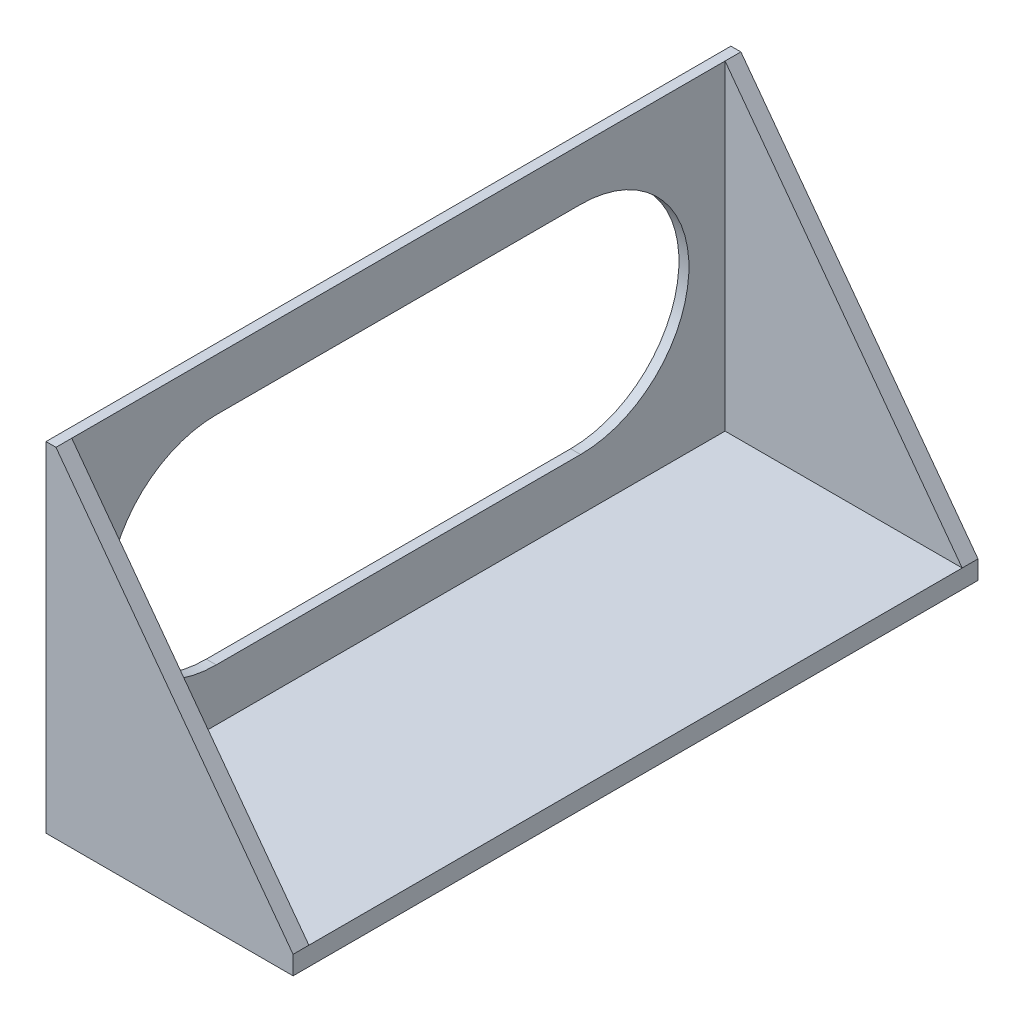
ISO-10303-21;
HEADER;
FILE_DESCRIPTION(('STEP AP214'),'2;1');
FILE_NAME('part.step','',(''),(''),'','','');
FILE_SCHEMA(('AUTOMOTIVE_DESIGN { 1 0 10303 214 1 1 1 1 }'));
ENDSEC;
DATA;
#1=APPLICATION_CONTEXT('core data for automotive mechanical design processes');
#2=APPLICATION_PROTOCOL_DEFINITION('international standard','automotive_design',2000,#1);
#3=PRODUCT_CONTEXT('',#1,'mechanical');
#4=PRODUCT('Part','Part','',(#3));
#5=PRODUCT_RELATED_PRODUCT_CATEGORY('part','',(#4));
#6=PRODUCT_DEFINITION_FORMATION('','',#4);
#7=PRODUCT_DEFINITION_CONTEXT('part definition',#1,'design');
#8=PRODUCT_DEFINITION('design','',#6,#7);
#9=PRODUCT_DEFINITION_SHAPE('','',#8);
#10=(LENGTH_UNIT() NAMED_UNIT(*) SI_UNIT(.MILLI.,.METRE.));
#11=(NAMED_UNIT(*) PLANE_ANGLE_UNIT() SI_UNIT($,.RADIAN.));
#12=(NAMED_UNIT(*) SI_UNIT($,.STERADIAN.) SOLID_ANGLE_UNIT());
#13=UNCERTAINTY_MEASURE_WITH_UNIT(LENGTH_MEASURE(1.E-05),#10,'distance_accuracy_value','');
#14=(GEOMETRIC_REPRESENTATION_CONTEXT(3) GLOBAL_UNCERTAINTY_ASSIGNED_CONTEXT((#13)) GLOBAL_UNIT_ASSIGNED_CONTEXT((#10,
#11,#12)) REPRESENTATION_CONTEXT('',''));
#15=CARTESIAN_POINT('',(0.,0.,0.));
#16=DIRECTION('',(0.,0.,1.));
#17=DIRECTION('',(1.,0.,0.));
#18=AXIS2_PLACEMENT_3D('',#15,#16,#17);
#19=CARTESIAN_POINT('',(-154.102,67.31,155.702));
#20=DIRECTION('',(-1.,0.,0.));
#21=DIRECTION('',(0.,0.,1.));
#22=AXIS2_PLACEMENT_3D('',#19,#20,#21);
#23=PLANE('',#22);
#24=CARTESIAN_POINT('',(-154.102,25.75,29.275));
#25=DIRECTION('',(-1.,0.,0.));
#26=DIRECTION('',(0.,0.,1.));
#27=AXIS2_PLACEMENT_3D('',#24,#25,#26);
#28=CIRCLE('',#27,17.4);
#29=CARTESIAN_POINT('',(-154.102,21.,46.014100931651));
#30=VERTEX_POINT('',#29);
#31=CARTESIAN_POINT('',(-154.102,8.35,29.275));
#32=VERTEX_POINT('',#31);
#33=EDGE_CURVE('E43',#30,#32,#28,.F.);
#34=ORIENTED_EDGE('',*,*,#33,.F.);
#35=DIRECTION('',(0.,0.,-1.));
#36=VECTOR('',#35,1.);
#37=CARTESIAN_POINT('',(-154.102,21.,46.014100931651));
#38=LINE('',#37,#36);
#39=CARTESIAN_POINT('',(-154.102,21.,48.175));
#40=VERTEX_POINT('',#39);
#41=EDGE_CURVE('E38',#40,#30,#38,.T.);
#42=ORIENTED_EDGE('',*,*,#41,.F.);
#43=DIRECTION('',(0.,-1.,0.));
#44=VECTOR('',#43,1.);
#45=CARTESIAN_POINT('',(-154.102,30.5,48.175));
#46=LINE('',#45,#44);
#47=CARTESIAN_POINT('',(-154.102,30.5,48.175));
#48=VERTEX_POINT('',#47);
#49=EDGE_CURVE('E111',#48,#40,#46,.T.);
#50=ORIENTED_EDGE('',*,*,#49,.F.);
#51=DIRECTION('',(0.,0.,1.));
#52=VECTOR('',#51,1.);
#53=CARTESIAN_POINT('',(-154.102,30.5,46.014100931651));
#54=LINE('',#53,#52);
#55=CARTESIAN_POINT('',(-154.102,30.5,46.014100931651));
#56=VERTEX_POINT('',#55);
#57=EDGE_CURVE('E118',#56,#48,#54,.T.);
#58=ORIENTED_EDGE('',*,*,#57,.F.);
#59=CARTESIAN_POINT('',(-154.102,43.15,29.275));
#60=VERTEX_POINT('',#59);
#61=EDGE_CURVE('E144',#60,#56,#28,.F.);
#62=ORIENTED_EDGE('',*,*,#61,.F.);
#63=DIRECTION('',(0.,0.,1.));
#64=VECTOR('',#63,1.);
#65=CARTESIAN_POINT('',(-154.102,43.15,-29.275));
#66=LINE('',#65,#64);
#67=CARTESIAN_POINT('',(-154.102,43.15,-29.275));
#68=VERTEX_POINT('',#67);
#69=EDGE_CURVE('E147',#68,#60,#66,.T.);
#70=ORIENTED_EDGE('',*,*,#69,.F.);
#71=CARTESIAN_POINT('',(-154.102,25.75,-29.275));
#72=DIRECTION('',(-1.,0.,0.));
#73=DIRECTION('',(0.,0.,1.));
#74=AXIS2_PLACEMENT_3D('',#71,#72,#73);
#75=CIRCLE('',#74,17.4);
#76=CARTESIAN_POINT('',(-154.102,8.35,-29.275));
#77=VERTEX_POINT('',#76);
#78=EDGE_CURVE('E60',#77,#68,#75,.F.);
#79=ORIENTED_EDGE('',*,*,#78,.F.);
#80=DIRECTION('',(0.,0.,-1.));
#81=VECTOR('',#80,1.);
#82=CARTESIAN_POINT('',(-154.102,8.35,-29.275));
#83=LINE('',#82,#81);
#84=EDGE_CURVE('E168',#32,#77,#83,.T.);
#85=ORIENTED_EDGE('',*,*,#84,.F.);
#86=EDGE_LOOP('',(#34,#42,#50,#58,#62,#70,#79,#85));
#87=FACE_BOUND('',#86,.T.);
#88=DIRECTION('',(0.,-1.,0.));
#89=VECTOR('',#88,1.);
#90=CARTESIAN_POINT('',(-154.102,67.31,-52.485));
#91=LINE('',#90,#89);
#92=CARTESIAN_POINT('',(-154.102,51.5,-52.485));
#93=VERTEX_POINT('',#92);
#94=CARTESIAN_POINT('',(-154.102,0.,-52.485));
#95=VERTEX_POINT('',#94);
#96=EDGE_CURVE('E227',#93,#95,#91,.T.);
#97=ORIENTED_EDGE('',*,*,#96,.F.);
#98=DIRECTION('',(0.,0.,1.));
#99=VECTOR('',#98,1.);
#100=CARTESIAN_POINT('',(-154.102,51.5,-55.025));
#101=LINE('',#100,#99);
#102=CARTESIAN_POINT('',(-154.102,51.5,52.485));
#103=VERTEX_POINT('',#102);
#104=EDGE_CURVE('E179',#93,#103,#101,.T.);
#105=ORIENTED_EDGE('',*,*,#104,.T.);
#106=DIRECTION('',(0.,1.,0.));
#107=VECTOR('',#106,1.);
#108=CARTESIAN_POINT('',(-154.102,67.31,52.485));
#109=LINE('',#108,#107);
#110=CARTESIAN_POINT('',(-154.102,0.,52.485));
#111=VERTEX_POINT('',#110);
#112=EDGE_CURVE('E217',#111,#103,#109,.T.);
#113=ORIENTED_EDGE('',*,*,#112,.F.);
#114=DIRECTION('',(0.,0.,-1.));
#115=VECTOR('',#114,1.);
#116=CARTESIAN_POINT('',(-154.102,0.,55.025));
#117=LINE('',#116,#115);
#118=EDGE_CURVE('E170',#111,#95,#117,.T.);
#119=ORIENTED_EDGE('',*,*,#118,.T.);
#120=EDGE_LOOP('',(#97,#105,#113,#119));
#121=FACE_BOUND('',#120,.T.);
#122=ADVANCED_FACE('F34',(#87,#121),#23,.F.);
#123=CARTESIAN_POINT('',(-265.792882910439,0.,55.025));
#124=DIRECTION('',(0.,1.,0.));
#125=DIRECTION('',(0.,0.,1.));
#126=AXIS2_PLACEMENT_3D('',#123,#124,#125);
#127=PLANE('',#126);
#128=DIRECTION('',(0.,0.,1.));
#129=VECTOR('',#128,1.);
#130=CARTESIAN_POINT('',(-116.002,0.,55.025));
#131=LINE('',#130,#129);
#132=CARTESIAN_POINT('',(-116.002,0.,-52.485));
#133=VERTEX_POINT('',#132);
#134=CARTESIAN_POINT('',(-116.002,0.,52.485));
#135=VERTEX_POINT('',#134);
#136=EDGE_CURVE('E203',#133,#135,#131,.T.);
#137=ORIENTED_EDGE('',*,*,#136,.F.);
#138=DIRECTION('',(-1.,0.,0.));
#139=VECTOR('',#138,1.);
#140=CARTESIAN_POINT('',(-265.792882910439,0.,-52.485));
#141=LINE('',#140,#139);
#142=EDGE_CURVE('E232',#133,#95,#141,.T.);
#143=ORIENTED_EDGE('',*,*,#142,.T.);
#144=ORIENTED_EDGE('',*,*,#118,.F.);
#145=DIRECTION('',(1.,0.,0.));
#146=VECTOR('',#145,1.);
#147=CARTESIAN_POINT('',(-265.792882910439,0.,52.485));
#148=LINE('',#147,#146);
#149=EDGE_CURVE('E220',#111,#135,#148,.T.);
#150=ORIENTED_EDGE('',*,*,#149,.T.);
#151=EDGE_LOOP('',(#137,#143,#144,#150));
#152=FACE_BOUND('',#151,.T.);
#153=ADVANCED_FACE('F296',(#152),#127,.T.);
#154=CARTESIAN_POINT('',(155.703,8.35,-29.275));
#155=DIRECTION('',(0.,-1.,0.));
#156=DIRECTION('',(0.,0.,-1.));
#157=AXIS2_PLACEMENT_3D('',#154,#155,#156);
#158=PLANE('',#157);
#159=DIRECTION('',(-1.,0.,0.));
#160=VECTOR('',#159,1.);
#161=CARTESIAN_POINT('',(155.703,8.35,29.275));
#162=LINE('',#161,#160);
#163=CARTESIAN_POINT('',(-155.702,8.35,29.275));
#164=VERTEX_POINT('',#163);
#165=EDGE_CURVE('E12',#32,#164,#162,.T.);
#166=ORIENTED_EDGE('',*,*,#165,.F.);
#167=ORIENTED_EDGE('',*,*,#84,.T.);
#168=DIRECTION('',(-1.,0.,0.));
#169=VECTOR('',#168,1.);
#170=CARTESIAN_POINT('',(155.703,8.35,-29.275));
#171=LINE('',#170,#169);
#172=CARTESIAN_POINT('',(-155.702,8.35,-29.275));
#173=VERTEX_POINT('',#172);
#174=EDGE_CURVE('E161',#77,#173,#171,.T.);
#175=ORIENTED_EDGE('',*,*,#174,.T.);
#176=DIRECTION('',(0.,0.,1.));
#177=VECTOR('',#176,1.);
#178=CARTESIAN_POINT('',(-155.702,8.35,-29.275));
#179=LINE('',#178,#177);
#180=EDGE_CURVE('E154',#173,#164,#179,.T.);
#181=ORIENTED_EDGE('',*,*,#180,.T.);
#182=EDGE_LOOP('',(#166,#167,#175,#181));
#183=FACE_BOUND('',#182,.T.);
#184=ADVANCED_FACE('F328',(#183),#158,.F.);
#185=CARTESIAN_POINT('',(155.703,25.75,-29.275));
#186=DIRECTION('',(-1.,0.,0.));
#187=DIRECTION('',(0.,0.,1.));
#188=AXIS2_PLACEMENT_3D('',#185,#186,#187);
#189=CYLINDRICAL_SURFACE('',#188,17.4);
#190=ORIENTED_EDGE('',*,*,#174,.F.);
#191=ORIENTED_EDGE('',*,*,#78,.T.);
#192=DIRECTION('',(-1.,0.,0.));
#193=VECTOR('',#192,1.);
#194=CARTESIAN_POINT('',(155.703,43.15,-29.275));
#195=LINE('',#194,#193);
#196=CARTESIAN_POINT('',(-155.702,43.15,-29.275));
#197=VERTEX_POINT('',#196);
#198=EDGE_CURVE('E153',#68,#197,#195,.T.);
#199=ORIENTED_EDGE('',*,*,#198,.T.);
#200=CARTESIAN_POINT('',(-155.702,25.75,-29.275));
#201=DIRECTION('',(-1.,0.,0.));
#202=DIRECTION('',(0.,0.,1.));
#203=AXIS2_PLACEMENT_3D('',#200,#201,#202);
#204=CIRCLE('',#203,17.4);
#205=EDGE_CURVE('E151',#197,#173,#204,.T.);
#206=ORIENTED_EDGE('',*,*,#205,.T.);
#207=EDGE_LOOP('',(#190,#191,#199,#206));
#208=FACE_BOUND('',#207,.T.);
#209=ADVANCED_FACE('F349',(#208),#189,.F.);
#210=CARTESIAN_POINT('',(155.703,43.15,-29.275));
#211=DIRECTION('',(0.,1.,0.));
#212=DIRECTION('',(0.,0.,1.));
#213=AXIS2_PLACEMENT_3D('',#210,#211,#212);
#214=PLANE('',#213);
#215=ORIENTED_EDGE('',*,*,#198,.F.);
#216=ORIENTED_EDGE('',*,*,#69,.T.);
#217=DIRECTION('',(-1.,0.,0.));
#218=VECTOR('',#217,1.);
#219=CARTESIAN_POINT('',(155.703,43.15,29.275));
#220=LINE('',#219,#218);
#221=CARTESIAN_POINT('',(-155.702,43.15,29.275));
#222=VERTEX_POINT('',#221);
#223=EDGE_CURVE('E150',#60,#222,#220,.T.);
#224=ORIENTED_EDGE('',*,*,#223,.T.);
#225=DIRECTION('',(0.,0.,-1.));
#226=VECTOR('',#225,1.);
#227=CARTESIAN_POINT('',(-155.702,43.15,-29.275));
#228=LINE('',#227,#226);
#229=EDGE_CURVE('E146',#222,#197,#228,.T.);
#230=ORIENTED_EDGE('',*,*,#229,.T.);
#231=EDGE_LOOP('',(#215,#216,#224,#230));
#232=FACE_BOUND('',#231,.T.);
#233=ADVANCED_FACE('F343',(#232),#214,.F.);
#234=CARTESIAN_POINT('',(155.703,25.75,29.275));
#235=DIRECTION('',(-1.,0.,0.));
#236=DIRECTION('',(0.,0.,1.));
#237=AXIS2_PLACEMENT_3D('',#234,#235,#236);
#238=CYLINDRICAL_SURFACE('',#237,17.4);
#239=ORIENTED_EDGE('',*,*,#61,.T.);
#240=DIRECTION('',(-1.,0.,0.));
#241=VECTOR('',#240,1.);
#242=CARTESIAN_POINT('',(155.703,30.5,46.014100931651));
#243=LINE('',#242,#241);
#244=CARTESIAN_POINT('',(-155.702,30.5,46.014100931651));
#245=VERTEX_POINT('',#244);
#246=EDGE_CURVE('E123',#56,#245,#243,.T.);
#247=ORIENTED_EDGE('',*,*,#246,.T.);
#248=CARTESIAN_POINT('',(-155.702,25.75,29.275));
#249=DIRECTION('',(-1.,0.,0.));
#250=DIRECTION('',(0.,0.,1.));
#251=AXIS2_PLACEMENT_3D('',#248,#249,#250);
#252=CIRCLE('',#251,17.4);
#253=EDGE_CURVE('E125',#245,#222,#252,.T.);
#254=ORIENTED_EDGE('',*,*,#253,.T.);
#255=ORIENTED_EDGE('',*,*,#223,.F.);
#256=EDGE_LOOP('',(#239,#247,#254,#255));
#257=FACE_BOUND('',#256,.T.);
#258=ADVANCED_FACE('F339',(#257),#238,.F.);
#259=CARTESIAN_POINT('',(155.703,30.5,46.014100931651));
#260=DIRECTION('',(0.,1.,0.));
#261=DIRECTION('',(0.,0.,1.));
#262=AXIS2_PLACEMENT_3D('',#259,#260,#261);
#263=PLANE('',#262);
#264=ORIENTED_EDGE('',*,*,#57,.T.);
#265=DIRECTION('',(-1.,0.,0.));
#266=VECTOR('',#265,1.);
#267=CARTESIAN_POINT('',(155.703,30.5,48.175));
#268=LINE('',#267,#266);
#269=CARTESIAN_POINT('',(-155.702,30.5,48.175));
#270=VERTEX_POINT('',#269);
#271=EDGE_CURVE('E107',#48,#270,#268,.T.);
#272=ORIENTED_EDGE('',*,*,#271,.T.);
#273=DIRECTION('',(0.,0.,-1.));
#274=VECTOR('',#273,1.);
#275=CARTESIAN_POINT('',(-155.702,30.5,46.014100931651));
#276=LINE('',#275,#274);
#277=EDGE_CURVE('E117',#270,#245,#276,.T.);
#278=ORIENTED_EDGE('',*,*,#277,.T.);
#279=ORIENTED_EDGE('',*,*,#246,.F.);
#280=EDGE_LOOP('',(#264,#272,#278,#279));
#281=FACE_BOUND('',#280,.T.);
#282=ADVANCED_FACE('F36',(#281),#263,.F.);
#283=CARTESIAN_POINT('',(155.703,30.5,48.175));
#284=DIRECTION('',(0.,0.,1.));
#285=DIRECTION('',(1.,0.,0.));
#286=AXIS2_PLACEMENT_3D('',#283,#284,#285);
#287=PLANE('',#286);
#288=ORIENTED_EDGE('',*,*,#49,.T.);
#289=DIRECTION('',(-1.,0.,0.));
#290=VECTOR('',#289,1.);
#291=CARTESIAN_POINT('',(155.703,21.,48.175));
#292=LINE('',#291,#290);
#293=CARTESIAN_POINT('',(-155.702,21.,48.175));
#294=VERTEX_POINT('',#293);
#295=EDGE_CURVE('E129',#40,#294,#292,.T.);
#296=ORIENTED_EDGE('',*,*,#295,.T.);
#297=DIRECTION('',(0.,1.,0.));
#298=VECTOR('',#297,1.);
#299=CARTESIAN_POINT('',(-155.702,30.5,48.175));
#300=LINE('',#299,#298);
#301=EDGE_CURVE('E114',#294,#270,#300,.T.);
#302=ORIENTED_EDGE('',*,*,#301,.T.);
#303=ORIENTED_EDGE('',*,*,#271,.F.);
#304=EDGE_LOOP('',(#288,#296,#302,#303));
#305=FACE_BOUND('',#304,.T.);
#306=ADVANCED_FACE('F109',(#305),#287,.F.);
#307=CARTESIAN_POINT('',(155.703,21.,46.014100931651));
#308=DIRECTION('',(0.,-1.,0.));
#309=DIRECTION('',(0.,0.,-1.));
#310=AXIS2_PLACEMENT_3D('',#307,#308,#309);
#311=PLANE('',#310);
#312=ORIENTED_EDGE('',*,*,#41,.T.);
#313=DIRECTION('',(-1.,0.,0.));
#314=VECTOR('',#313,1.);
#315=CARTESIAN_POINT('',(155.703,21.,46.014100931651));
#316=LINE('',#315,#314);
#317=CARTESIAN_POINT('',(-155.702,21.,46.014100931651));
#318=VERTEX_POINT('',#317);
#319=EDGE_CURVE('E138',#30,#318,#316,.T.);
#320=ORIENTED_EDGE('',*,*,#319,.T.);
#321=DIRECTION('',(0.,0.,1.));
#322=VECTOR('',#321,1.);
#323=CARTESIAN_POINT('',(-155.702,21.,46.014100931651));
#324=LINE('',#323,#322);
#325=EDGE_CURVE('E134',#318,#294,#324,.T.);
#326=ORIENTED_EDGE('',*,*,#325,.T.);
#327=ORIENTED_EDGE('',*,*,#295,.F.);
#328=EDGE_LOOP('',(#312,#320,#326,#327));
#329=FACE_BOUND('',#328,.T.);
#330=ADVANCED_FACE('F333',(#329),#311,.F.);
#331=CARTESIAN_POINT('',(-155.702,67.31,155.702));
#332=DIRECTION('',(-1.,0.,0.));
#333=DIRECTION('',(0.,0.,1.));
#334=AXIS2_PLACEMENT_3D('',#331,#332,#333);
#335=PLANE('',#334);
#336=DIRECTION('',(0.,1.,0.));
#337=VECTOR('',#336,1.);
#338=CARTESIAN_POINT('',(-155.702,0.,-55.025));
#339=LINE('',#338,#337);
#340=CARTESIAN_POINT('',(-155.702,-3.,-55.025));
#341=VERTEX_POINT('',#340);
#342=CARTESIAN_POINT('',(-155.702,51.5,-55.025));
#343=VERTEX_POINT('',#342);
#344=EDGE_CURVE('E175',#341,#343,#339,.T.);
#345=ORIENTED_EDGE('',*,*,#344,.F.);
#346=DIRECTION('',(0.,0.,-1.));
#347=VECTOR('',#346,1.);
#348=CARTESIAN_POINT('',(-155.702,-3.,55.025));
#349=LINE('',#348,#347);
#350=CARTESIAN_POINT('',(-155.702,-3.,55.025));
#351=VERTEX_POINT('',#350);
#352=EDGE_CURVE('E197',#351,#341,#349,.T.);
#353=ORIENTED_EDGE('',*,*,#352,.F.);
#354=DIRECTION('',(0.,-1.,0.));
#355=VECTOR('',#354,1.);
#356=CARTESIAN_POINT('',(-155.702,51.5,55.025));
#357=LINE('',#356,#355);
#358=CARTESIAN_POINT('',(-155.702,51.5,55.025));
#359=VERTEX_POINT('',#358);
#360=EDGE_CURVE('E174',#359,#351,#357,.T.);
#361=ORIENTED_EDGE('',*,*,#360,.F.);
#362=DIRECTION('',(0.,0.,1.));
#363=VECTOR('',#362,1.);
#364=CARTESIAN_POINT('',(-155.702,51.5,-55.025));
#365=LINE('',#364,#363);
#366=EDGE_CURVE('E180',#343,#359,#365,.T.);
#367=ORIENTED_EDGE('',*,*,#366,.F.);
#368=EDGE_LOOP('',(#345,#353,#361,#367));
#369=FACE_BOUND('',#368,.T.);
#370=ORIENTED_EDGE('',*,*,#325,.F.);
#371=EDGE_CURVE('E137',#164,#318,#252,.T.);
#372=ORIENTED_EDGE('',*,*,#371,.F.);
#373=ORIENTED_EDGE('',*,*,#180,.F.);
#374=ORIENTED_EDGE('',*,*,#205,.F.);
#375=ORIENTED_EDGE('',*,*,#229,.F.);
#376=ORIENTED_EDGE('',*,*,#253,.F.);
#377=ORIENTED_EDGE('',*,*,#277,.F.);
#378=ORIENTED_EDGE('',*,*,#301,.F.);
#379=EDGE_LOOP('',(#370,#372,#373,#374,#375,#376,#377,#378));
#380=FACE_BOUND('',#379,.T.);
#381=ADVANCED_FACE('F274',(#369,#380),#335,.T.);
#382=ORIENTED_EDGE('',*,*,#371,.T.);
#383=ORIENTED_EDGE('',*,*,#319,.F.);
#384=ORIENTED_EDGE('',*,*,#33,.T.);
#385=ORIENTED_EDGE('',*,*,#165,.T.);
#386=EDGE_LOOP('',(#382,#383,#384,#385));
#387=FACE_BOUND('',#386,.T.);
#388=ADVANCED_FACE('F345',(#387),#238,.F.);
#389=CARTESIAN_POINT('',(-277.206125444365,0.,-55.025));
#390=DIRECTION('',(0.,0.,-1.));
#391=DIRECTION('',(-1.,0.,0.));
#392=AXIS2_PLACEMENT_3D('',#389,#390,#391);
#393=PLANE('',#392);
#394=DIRECTION('',(1.,0.,0.));
#395=VECTOR('',#394,1.);
#396=CARTESIAN_POINT('',(-277.206125444365,51.5,-55.025));
#397=LINE('',#396,#395);
#398=CARTESIAN_POINT('',(-154.102,51.5,-55.025));
#399=VERTEX_POINT('',#398);
#400=EDGE_CURVE('E171',#343,#399,#397,.T.);
#401=ORIENTED_EDGE('',*,*,#400,.T.);
#402=DIRECTION('',(0.59474213467808,-0.80391653375121,0.));
#403=VECTOR('',#402,1.);
#404=CARTESIAN_POINT('',(-154.102,51.5,-55.025));
#405=LINE('',#404,#403);
#406=CARTESIAN_POINT('',(-116.002,0.,-55.025));
#407=VERTEX_POINT('',#406);
#408=EDGE_CURVE('E235',#399,#407,#405,.T.);
#409=ORIENTED_EDGE('',*,*,#408,.T.);
#410=DIRECTION('',(0.,1.,0.));
#411=VECTOR('',#410,1.);
#412=CARTESIAN_POINT('',(-116.002,0.,-55.025));
#413=LINE('',#412,#411);
#414=CARTESIAN_POINT('',(-116.002,-3.,-55.025));
#415=VERTEX_POINT('',#414);
#416=EDGE_CURVE('E205',#415,#407,#413,.T.);
#417=ORIENTED_EDGE('',*,*,#416,.F.);
#418=DIRECTION('',(1.,0.,0.));
#419=VECTOR('',#418,1.);
#420=CARTESIAN_POINT('',(-265.792882910439,-3.,-55.025));
#421=LINE('',#420,#419);
#422=EDGE_CURVE('E194',#341,#415,#421,.T.);
#423=ORIENTED_EDGE('',*,*,#422,.F.);
#424=ORIENTED_EDGE('',*,*,#344,.T.);
#425=EDGE_LOOP('',(#401,#409,#417,#423,#424));
#426=FACE_BOUND('',#425,.T.);
#427=ADVANCED_FACE('F242',(#426),#393,.T.);
#428=CARTESIAN_POINT('',(-277.206125444365,51.5,55.025));
#429=DIRECTION('',(0.,0.,1.));
#430=DIRECTION('',(1.,0.,0.));
#431=AXIS2_PLACEMENT_3D('',#428,#429,#430);
#432=PLANE('',#431);
#433=DIRECTION('',(1.,0.,0.));
#434=VECTOR('',#433,1.);
#435=CARTESIAN_POINT('',(-277.206125444365,51.5,55.025));
#436=LINE('',#435,#434);
#437=CARTESIAN_POINT('',(-154.102,51.5,55.025));
#438=VERTEX_POINT('',#437);
#439=EDGE_CURVE('E176',#359,#438,#436,.T.);
#440=ORIENTED_EDGE('',*,*,#439,.F.);
#441=ORIENTED_EDGE('',*,*,#360,.T.);
#442=DIRECTION('',(1.,0.,0.));
#443=VECTOR('',#442,1.);
#444=CARTESIAN_POINT('',(-265.792882910439,-3.,55.025));
#445=LINE('',#444,#443);
#446=CARTESIAN_POINT('',(-116.002,-3.,55.025));
#447=VERTEX_POINT('',#446);
#448=EDGE_CURVE('E185',#351,#447,#445,.T.);
#449=ORIENTED_EDGE('',*,*,#448,.T.);
#450=DIRECTION('',(0.,-1.,0.));
#451=VECTOR('',#450,1.);
#452=CARTESIAN_POINT('',(-116.002,0.,55.025));
#453=LINE('',#452,#451);
#454=CARTESIAN_POINT('',(-116.002,0.,55.025));
#455=VERTEX_POINT('',#454);
#456=EDGE_CURVE('E211',#455,#447,#453,.T.);
#457=ORIENTED_EDGE('',*,*,#456,.F.);
#458=DIRECTION('',(0.59474213467808,-0.80391653375121,0.));
#459=VECTOR('',#458,1.);
#460=CARTESIAN_POINT('',(-154.102,51.5,55.025));
#461=LINE('',#460,#459);
#462=EDGE_CURVE('E223',#438,#455,#461,.T.);
#463=ORIENTED_EDGE('',*,*,#462,.F.);
#464=EDGE_LOOP('',(#440,#441,#449,#457,#463));
#465=FACE_BOUND('',#464,.T.);
#466=ADVANCED_FACE('F307',(#465),#432,.T.);
#467=CARTESIAN_POINT('',(-277.206125444365,51.5,-55.025));
#468=DIRECTION('',(0.,1.,0.));
#469=DIRECTION('',(0.,0.,1.));
#470=AXIS2_PLACEMENT_3D('',#467,#468,#469);
#471=PLANE('',#470);
#472=ORIENTED_EDGE('',*,*,#366,.T.);
#473=ORIENTED_EDGE('',*,*,#439,.T.);
#474=DIRECTION('',(0.,0.,1.));
#475=VECTOR('',#474,1.);
#476=CARTESIAN_POINT('',(-154.102,51.5,-55.025));
#477=LINE('',#476,#475);
#478=EDGE_CURVE('E214',#438,#103,#477,.F.);
#479=ORIENTED_EDGE('',*,*,#478,.T.);
#480=ORIENTED_EDGE('',*,*,#104,.F.);
#481=EDGE_CURVE('E188',#399,#93,#101,.T.);
#482=ORIENTED_EDGE('',*,*,#481,.F.);
#483=ORIENTED_EDGE('',*,*,#400,.F.);
#484=EDGE_LOOP('',(#472,#473,#479,#480,#482,#483));
#485=FACE_BOUND('',#484,.T.);
#486=ADVANCED_FACE('F278',(#485),#471,.T.);
#487=CARTESIAN_POINT('',(-265.792882910439,-3.,55.025));
#488=DIRECTION('',(0.,-1.,0.));
#489=DIRECTION('',(0.,0.,-1.));
#490=AXIS2_PLACEMENT_3D('',#487,#488,#489);
#491=PLANE('',#490);
#492=ORIENTED_EDGE('',*,*,#422,.T.);
#493=DIRECTION('',(0.,0.,-1.));
#494=VECTOR('',#493,1.);
#495=CARTESIAN_POINT('',(-116.002,-3.,55.025));
#496=LINE('',#495,#494);
#497=EDGE_CURVE('E208',#447,#415,#496,.T.);
#498=ORIENTED_EDGE('',*,*,#497,.F.);
#499=ORIENTED_EDGE('',*,*,#448,.F.);
#500=ORIENTED_EDGE('',*,*,#352,.T.);
#501=EDGE_LOOP('',(#492,#498,#499,#500));
#502=FACE_BOUND('',#501,.T.);
#503=ADVANCED_FACE('F261',(#502),#491,.T.);
#504=CARTESIAN_POINT('',(-116.002,0.,0.));
#505=DIRECTION('',(1.,0.,0.));
#506=DIRECTION('',(0.,0.,-1.));
#507=AXIS2_PLACEMENT_3D('',#504,#505,#506);
#508=PLANE('',#507);
#509=EDGE_CURVE('E200',#407,#133,#131,.T.);
#510=ORIENTED_EDGE('',*,*,#509,.T.);
#511=ORIENTED_EDGE('',*,*,#136,.T.);
#512=EDGE_CURVE('E204',#135,#455,#131,.T.);
#513=ORIENTED_EDGE('',*,*,#512,.T.);
#514=ORIENTED_EDGE('',*,*,#456,.T.);
#515=ORIENTED_EDGE('',*,*,#497,.T.);
#516=ORIENTED_EDGE('',*,*,#416,.T.);
#517=EDGE_LOOP('',(#510,#511,#513,#514,#515,#516));
#518=FACE_BOUND('',#517,.T.);
#519=ADVANCED_FACE('F251',(#518),#508,.T.);
#520=CARTESIAN_POINT('',(-154.102,51.5,55.025));
#521=DIRECTION('',(-0.803916533751211,-0.59474213467808,0.));
#522=DIRECTION('',(0.59474213467808,-0.80391653375121,0.));
#523=AXIS2_PLACEMENT_3D('',#520,#521,#522);
#524=PLANE('',#523);
#525=ORIENTED_EDGE('',*,*,#478,.F.);
#526=ORIENTED_EDGE('',*,*,#462,.T.);
#527=ORIENTED_EDGE('',*,*,#512,.F.);
#528=DIRECTION('',(0.59474213467808,-0.80391653375121,0.));
#529=VECTOR('',#528,1.);
#530=CARTESIAN_POINT('',(-154.102,51.5,52.485));
#531=LINE('',#530,#529);
#532=EDGE_CURVE('E224',#103,#135,#531,.T.);
#533=ORIENTED_EDGE('',*,*,#532,.F.);
#534=EDGE_LOOP('',(#525,#526,#527,#533));
#535=FACE_BOUND('',#534,.T.);
#536=ADVANCED_FACE('F311',(#535),#524,.F.);
#537=CARTESIAN_POINT('',(-135.852,24.25,52.485));
#538=DIRECTION('',(0.,0.,1.));
#539=DIRECTION('',(1.,0.,0.));
#540=AXIS2_PLACEMENT_3D('',#537,#538,#539);
#541=PLANE('',#540);
#542=ORIENTED_EDGE('',*,*,#149,.F.);
#543=ORIENTED_EDGE('',*,*,#112,.T.);
#544=ORIENTED_EDGE('',*,*,#532,.T.);
#545=EDGE_LOOP('',(#542,#543,#544));
#546=FACE_BOUND('',#545,.T.);
#547=ADVANCED_FACE('F313',(#546),#541,.F.);
#548=CARTESIAN_POINT('',(-154.102,51.5,-55.025));
#549=DIRECTION('',(0.803916533751211,0.59474213467808,0.));
#550=DIRECTION('',(0.59474213467808,-0.80391653375121,0.));
#551=AXIS2_PLACEMENT_3D('',#548,#549,#550);
#552=PLANE('',#551);
#553=ORIENTED_EDGE('',*,*,#481,.T.);
#554=DIRECTION('',(0.59474213467808,-0.80391653375121,0.));
#555=VECTOR('',#554,1.);
#556=CARTESIAN_POINT('',(-154.102,51.5,-52.485));
#557=LINE('',#556,#555);
#558=EDGE_CURVE('E51',#93,#133,#557,.T.);
#559=ORIENTED_EDGE('',*,*,#558,.T.);
#560=ORIENTED_EDGE('',*,*,#509,.F.);
#561=ORIENTED_EDGE('',*,*,#408,.F.);
#562=EDGE_LOOP('',(#553,#559,#560,#561));
#563=FACE_BOUND('',#562,.T.);
#564=ADVANCED_FACE('F285',(#563),#552,.T.);
#565=CARTESIAN_POINT('',(-135.852,24.25,-52.485));
#566=DIRECTION('',(0.,0.,-1.));
#567=DIRECTION('',(-1.,0.,0.));
#568=AXIS2_PLACEMENT_3D('',#565,#566,#567);
#569=PLANE('',#568);
#570=ORIENTED_EDGE('',*,*,#558,.F.);
#571=ORIENTED_EDGE('',*,*,#96,.T.);
#572=ORIENTED_EDGE('',*,*,#142,.F.);
#573=EDGE_LOOP('',(#570,#571,#572));
#574=FACE_BOUND('',#573,.T.);
#575=ADVANCED_FACE('F289',(#574),#569,.F.);
#576=CLOSED_SHELL('',(#122,#153,#184,#209,#233,#258,#282,#306,#330,#381,#388,#427,#466,#486,
#503,#519,#536,#547,#564,#575));
#577=MANIFOLD_SOLID_BREP('B2',#576);
#578=ADVANCED_BREP_SHAPE_REPRESENTATION('',(#18,#577),#14);
#579=SHAPE_DEFINITION_REPRESENTATION(#9,#578);
ENDSEC;
END-ISO-10303-21;
